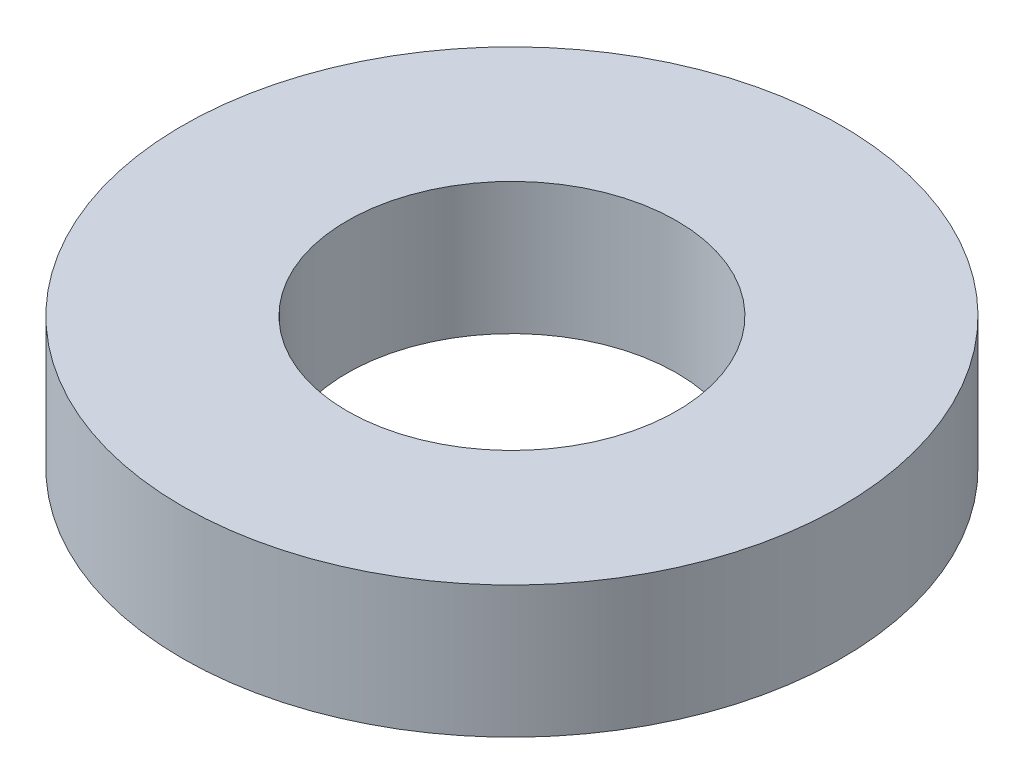
ISO-10303-21;
HEADER;
FILE_DESCRIPTION(('STEP AP214'),'2;1');
FILE_NAME('part.step','',(''),(''),'','','');
FILE_SCHEMA(('AUTOMOTIVE_DESIGN { 1 0 10303 214 1 1 1 1 }'));
ENDSEC;
DATA;
#1=APPLICATION_CONTEXT('core data for automotive mechanical design processes');
#2=APPLICATION_PROTOCOL_DEFINITION('international standard','automotive_design',2000,#1);
#3=PRODUCT_CONTEXT('',#1,'mechanical');
#4=PRODUCT('Part','Part','',(#3));
#5=PRODUCT_RELATED_PRODUCT_CATEGORY('part','',(#4));
#6=PRODUCT_DEFINITION_FORMATION('','',#4);
#7=PRODUCT_DEFINITION_CONTEXT('part definition',#1,'design');
#8=PRODUCT_DEFINITION('design','',#6,#7);
#9=PRODUCT_DEFINITION_SHAPE('','',#8);
#10=(LENGTH_UNIT() NAMED_UNIT(*) SI_UNIT(.MILLI.,.METRE.));
#11=(NAMED_UNIT(*) PLANE_ANGLE_UNIT() SI_UNIT($,.RADIAN.));
#12=(NAMED_UNIT(*) SI_UNIT($,.STERADIAN.) SOLID_ANGLE_UNIT());
#13=UNCERTAINTY_MEASURE_WITH_UNIT(LENGTH_MEASURE(1.E-05),#10,'distance_accuracy_value','');
#14=(GEOMETRIC_REPRESENTATION_CONTEXT(3) GLOBAL_UNCERTAINTY_ASSIGNED_CONTEXT((#13)) GLOBAL_UNIT_ASSIGNED_CONTEXT((#10,
#11,#12)) REPRESENTATION_CONTEXT('',''));
#15=CARTESIAN_POINT('',(0.,0.,0.));
#16=DIRECTION('',(0.,0.,1.));
#17=DIRECTION('',(1.,0.,0.));
#18=AXIS2_PLACEMENT_3D('',#15,#16,#17);
#19=CARTESIAN_POINT('',(0.,2.,0.));
#20=DIRECTION('',(0.,1.,0.));
#21=DIRECTION('',(0.,0.,1.));
#22=AXIS2_PLACEMENT_3D('',#19,#20,#21);
#23=PLANE('',#22);
#24=CARTESIAN_POINT('',(0.,2.,0.));
#25=DIRECTION('',(0.,1.,0.));
#26=DIRECTION('',(0.,0.,1.));
#27=AXIS2_PLACEMENT_3D('',#24,#25,#26);
#28=CIRCLE('',#27,5.);
#29=CARTESIAN_POINT('',(0.,2.,5.));
#30=VERTEX_POINT('',#29);
#31=EDGE_CURVE('E10',#30,#30,#28,.T.);
#32=ORIENTED_EDGE('',*,*,#31,.T.);
#33=EDGE_LOOP('',(#32));
#34=FACE_BOUND('',#33,.T.);
#35=CARTESIAN_POINT('',(0.,2.,0.));
#36=DIRECTION('',(0.,1.,0.));
#37=DIRECTION('',(0.,0.,1.));
#38=AXIS2_PLACEMENT_3D('',#35,#36,#37);
#39=CIRCLE('',#38,2.5);
#40=CARTESIAN_POINT('',(0.,2.,2.5));
#41=VERTEX_POINT('',#40);
#42=EDGE_CURVE('E44',#41,#41,#39,.T.);
#43=ORIENTED_EDGE('',*,*,#42,.F.);
#44=EDGE_LOOP('',(#43));
#45=FACE_BOUND('',#44,.T.);
#46=ADVANCED_FACE('F33',(#34,#45),#23,.T.);
#47=CARTESIAN_POINT('',(0.,0.,0.));
#48=DIRECTION('',(0.,1.,0.));
#49=DIRECTION('',(0.,0.,1.));
#50=AXIS2_PLACEMENT_3D('',#47,#48,#49);
#51=PLANE('',#50);
#52=CARTESIAN_POINT('',(0.,0.,0.));
#53=DIRECTION('',(0.,1.,0.));
#54=DIRECTION('',(0.,0.,1.));
#55=AXIS2_PLACEMENT_3D('',#52,#53,#54);
#56=CIRCLE('',#55,5.);
#57=CARTESIAN_POINT('',(0.,0.,5.));
#58=VERTEX_POINT('',#57);
#59=EDGE_CURVE('E37',#58,#58,#56,.T.);
#60=ORIENTED_EDGE('',*,*,#59,.F.);
#61=EDGE_LOOP('',(#60));
#62=FACE_BOUND('',#61,.T.);
#63=CARTESIAN_POINT('',(0.,0.,0.));
#64=DIRECTION('',(0.,1.,0.));
#65=DIRECTION('',(0.,0.,1.));
#66=AXIS2_PLACEMENT_3D('',#63,#64,#65);
#67=CIRCLE('',#66,2.5);
#68=CARTESIAN_POINT('',(0.,0.,2.5));
#69=VERTEX_POINT('',#68);
#70=EDGE_CURVE('E46',#69,#69,#67,.T.);
#71=ORIENTED_EDGE('',*,*,#70,.T.);
#72=EDGE_LOOP('',(#71));
#73=FACE_BOUND('',#72,.T.);
#74=ADVANCED_FACE('F56',(#62,#73),#51,.F.);
#75=CARTESIAN_POINT('',(0.,2.,0.));
#76=DIRECTION('',(0.,-1.,0.));
#77=DIRECTION('',(0.,0.,-1.));
#78=AXIS2_PLACEMENT_3D('',#75,#76,#77);
#79=CYLINDRICAL_SURFACE('',#78,5.);
#80=ORIENTED_EDGE('',*,*,#31,.F.);
#81=EDGE_LOOP('',(#80));
#82=FACE_BOUND('',#81,.T.);
#83=ORIENTED_EDGE('',*,*,#59,.T.);
#84=EDGE_LOOP('',(#83));
#85=FACE_BOUND('',#84,.T.);
#86=ADVANCED_FACE('F35',(#82,#85),#79,.T.);
#87=CARTESIAN_POINT('',(0.,2.,0.));
#88=DIRECTION('',(0.,-1.,0.));
#89=DIRECTION('',(0.,0.,-1.));
#90=AXIS2_PLACEMENT_3D('',#87,#88,#89);
#91=CYLINDRICAL_SURFACE('',#90,2.5);
#92=ORIENTED_EDGE('',*,*,#42,.T.);
#93=EDGE_LOOP('',(#92));
#94=FACE_BOUND('',#93,.T.);
#95=ORIENTED_EDGE('',*,*,#70,.F.);
#96=EDGE_LOOP('',(#95));
#97=FACE_BOUND('',#96,.T.);
#98=ADVANCED_FACE('F52',(#94,#97),#91,.F.);
#99=CLOSED_SHELL('',(#46,#74,#86,#98));
#100=MANIFOLD_SOLID_BREP('B2',#99);
#101=ADVANCED_BREP_SHAPE_REPRESENTATION('',(#18,#100),#14);
#102=SHAPE_DEFINITION_REPRESENTATION(#9,#101);
ENDSEC;
END-ISO-10303-21;
